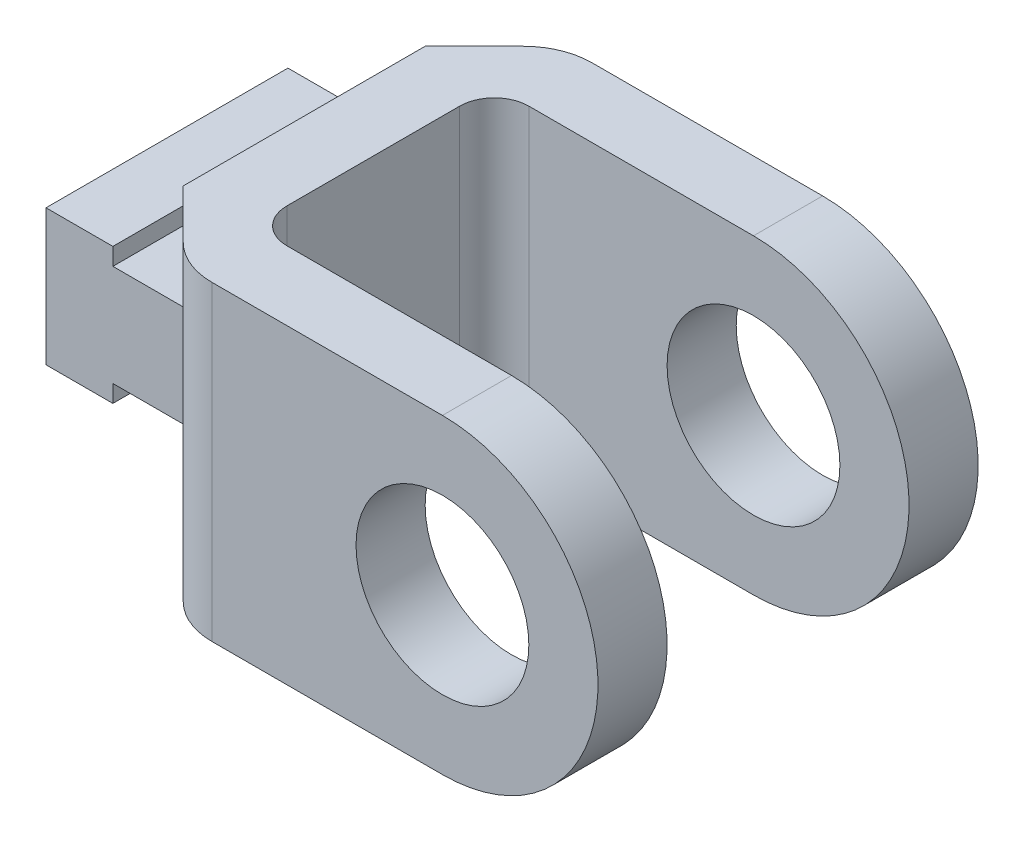
ISO-10303-21;
HEADER;
FILE_DESCRIPTION(('STEP AP214'),'2;1');
FILE_NAME('part.step','',(''),(''),'','','');
FILE_SCHEMA(('AUTOMOTIVE_DESIGN { 1 0 10303 214 1 1 1 1 }'));
ENDSEC;
DATA;
#1=APPLICATION_CONTEXT('core data for automotive mechanical design processes');
#2=APPLICATION_PROTOCOL_DEFINITION('international standard','automotive_design',2000,#1);
#3=PRODUCT_CONTEXT('',#1,'mechanical');
#4=PRODUCT('Part','Part','',(#3));
#5=PRODUCT_RELATED_PRODUCT_CATEGORY('part','',(#4));
#6=PRODUCT_DEFINITION_FORMATION('','',#4);
#7=PRODUCT_DEFINITION_CONTEXT('part definition',#1,'design');
#8=PRODUCT_DEFINITION('design','',#6,#7);
#9=PRODUCT_DEFINITION_SHAPE('','',#8);
#10=(LENGTH_UNIT() NAMED_UNIT(*) SI_UNIT(.MILLI.,.METRE.));
#11=(NAMED_UNIT(*) PLANE_ANGLE_UNIT() SI_UNIT($,.RADIAN.));
#12=(NAMED_UNIT(*) SI_UNIT($,.STERADIAN.) SOLID_ANGLE_UNIT());
#13=UNCERTAINTY_MEASURE_WITH_UNIT(LENGTH_MEASURE(1.E-05),#10,'distance_accuracy_value','');
#14=(GEOMETRIC_REPRESENTATION_CONTEXT(3) GLOBAL_UNCERTAINTY_ASSIGNED_CONTEXT((#13)) GLOBAL_UNIT_ASSIGNED_CONTEXT((#10,
#11,#12)) REPRESENTATION_CONTEXT('',''));
#15=CARTESIAN_POINT('',(0.,0.,0.));
#16=DIRECTION('',(0.,0.,1.));
#17=DIRECTION('',(1.,0.,0.));
#18=AXIS2_PLACEMENT_3D('',#15,#16,#17);
#19=CARTESIAN_POINT('',(-1.,4.5,7.));
#20=DIRECTION('',(0.,-1.,0.));
#21=DIRECTION('',(0.,0.,-1.));
#22=AXIS2_PLACEMENT_3D('',#19,#20,#21);
#23=PLANE('',#22);
#24=DIRECTION('',(0.707106781186548,0.,0.707106781186548));
#25=VECTOR('',#24,1.);
#26=CARTESIAN_POINT('',(-1.,4.5,7.));
#27=LINE('',#26,#25);
#28=CARTESIAN_POINT('',(-1.,4.5,7.));
#29=VERTEX_POINT('',#28);
#30=CARTESIAN_POINT('',(0.414213562373097,4.5,8.4142135623731));
#31=VERTEX_POINT('',#30);
#32=EDGE_CURVE('E203',#29,#31,#27,.T.);
#33=ORIENTED_EDGE('',*,*,#32,.T.);
#34=CARTESIAN_POINT('',(1.82842712474619,4.5,7.));
#35=DIRECTION('',(0.,-1.,0.));
#36=DIRECTION('',(0.,0.,-1.));
#37=AXIS2_PLACEMENT_3D('',#34,#35,#36);
#38=CIRCLE('',#37,2.);
#39=CARTESIAN_POINT('',(1.82842712474619,4.50000000000001,9.));
#40=VERTEX_POINT('',#39);
#41=EDGE_CURVE('E240',#31,#40,#38,.F.);
#42=ORIENTED_EDGE('',*,*,#41,.T.);
#43=DIRECTION('',(-1.,0.,0.));
#44=VECTOR('',#43,1.);
#45=CARTESIAN_POINT('',(-1.,4.5,9.));
#46=LINE('',#45,#44);
#47=CARTESIAN_POINT('',(8.49999999999999,4.50000000000001,9.));
#48=VERTEX_POINT('',#47);
#49=EDGE_CURVE('E274',#48,#40,#46,.T.);
#50=ORIENTED_EDGE('',*,*,#49,.F.);
#51=DIRECTION('',(0.,0.,-1.));
#52=VECTOR('',#51,1.);
#53=CARTESIAN_POINT('',(8.49999999999999,4.50000000000001,9.));
#54=LINE('',#53,#52);
#55=CARTESIAN_POINT('',(8.49999999999999,4.50000000000001,7.));
#56=VERTEX_POINT('',#55);
#57=EDGE_CURVE('E263',#48,#56,#54,.T.);
#58=ORIENTED_EDGE('',*,*,#57,.T.);
#59=DIRECTION('',(-1.,0.,0.));
#60=VECTOR('',#59,1.);
#61=CARTESIAN_POINT('',(-1.,4.5,7.));
#62=LINE('',#61,#60);
#63=CARTESIAN_POINT('',(2.,4.50000000000001,7.));
#64=VERTEX_POINT('',#63);
#65=EDGE_CURVE('E255',#56,#64,#62,.T.);
#66=ORIENTED_EDGE('',*,*,#65,.T.);
#67=CARTESIAN_POINT('',(2.,4.5,6.));
#68=DIRECTION('',(0.,-1.,0.));
#69=DIRECTION('',(0.,0.,-1.));
#70=AXIS2_PLACEMENT_3D('',#67,#68,#69);
#71=CIRCLE('',#70,1.);
#72=CARTESIAN_POINT('',(1.,4.5,6.));
#73=VERTEX_POINT('',#72);
#74=EDGE_CURVE('E41',#64,#73,#71,.T.);
#75=ORIENTED_EDGE('',*,*,#74,.T.);
#76=DIRECTION('',(0.,0.,-1.));
#77=VECTOR('',#76,1.);
#78=CARTESIAN_POINT('',(1.,4.5,7.));
#79=LINE('',#78,#77);
#80=CARTESIAN_POINT('',(1.,4.5,1.));
#81=VERTEX_POINT('',#80);
#82=EDGE_CURVE('E211',#73,#81,#79,.T.);
#83=ORIENTED_EDGE('',*,*,#82,.T.);
#84=CARTESIAN_POINT('',(2.,4.5,1.));
#85=DIRECTION('',(0.,-1.,0.));
#86=DIRECTION('',(0.,0.,-1.));
#87=AXIS2_PLACEMENT_3D('',#84,#85,#86);
#88=CIRCLE('',#87,1.);
#89=CARTESIAN_POINT('',(2.,4.50000000000001,0.));
#90=VERTEX_POINT('',#89);
#91=EDGE_CURVE('E224',#81,#90,#88,.T.);
#92=ORIENTED_EDGE('',*,*,#91,.T.);
#93=DIRECTION('',(-1.,0.,0.));
#94=VECTOR('',#93,1.);
#95=CARTESIAN_POINT('',(-1.,4.5,0.));
#96=LINE('',#95,#94);
#97=CARTESIAN_POINT('',(8.49999999999999,4.50000000000001,0.));
#98=VERTEX_POINT('',#97);
#99=EDGE_CURVE('E297',#98,#90,#96,.T.);
#100=ORIENTED_EDGE('',*,*,#99,.F.);
#101=DIRECTION('',(0.,0.,1.));
#102=VECTOR('',#101,1.);
#103=CARTESIAN_POINT('',(8.49999999999999,4.50000000000001,-2.));
#104=LINE('',#103,#102);
#105=CARTESIAN_POINT('',(8.49999999999999,4.50000000000001,-2.));
#106=VERTEX_POINT('',#105);
#107=EDGE_CURVE('E312',#106,#98,#104,.T.);
#108=ORIENTED_EDGE('',*,*,#107,.F.);
#109=DIRECTION('',(-1.,0.,0.));
#110=VECTOR('',#109,1.);
#111=CARTESIAN_POINT('',(-1.,4.5,-2.));
#112=LINE('',#111,#110);
#113=CARTESIAN_POINT('',(1.82842712474619,4.50000000000001,-2.));
#114=VERTEX_POINT('',#113);
#115=EDGE_CURVE('E300',#106,#114,#112,.T.);
#116=ORIENTED_EDGE('',*,*,#115,.T.);
#117=CARTESIAN_POINT('',(1.82842712474619,4.5,0.));
#118=DIRECTION('',(0.,-1.,0.));
#119=DIRECTION('',(0.,0.,-1.));
#120=AXIS2_PLACEMENT_3D('',#117,#118,#119);
#121=CIRCLE('',#120,2.);
#122=CARTESIAN_POINT('',(0.414213562373095,4.5,-1.41421356237309));
#123=VERTEX_POINT('',#122);
#124=EDGE_CURVE('E232',#114,#123,#121,.F.);
#125=ORIENTED_EDGE('',*,*,#124,.T.);
#126=DIRECTION('',(0.707106781186548,0.,-0.707106781186548));
#127=VECTOR('',#126,1.);
#128=CARTESIAN_POINT('',(-1.,4.5,0.));
#129=LINE('',#128,#127);
#130=CARTESIAN_POINT('',(-1.,4.5,0.));
#131=VERTEX_POINT('',#130);
#132=EDGE_CURVE('E278',#131,#123,#129,.T.);
#133=ORIENTED_EDGE('',*,*,#132,.F.);
#134=DIRECTION('',(0.,0.,-1.));
#135=VECTOR('',#134,1.);
#136=CARTESIAN_POINT('',(-1.,4.5,7.));
#137=LINE('',#136,#135);
#138=EDGE_CURVE('E208',#29,#131,#137,.T.);
#139=ORIENTED_EDGE('',*,*,#138,.F.);
#140=EDGE_LOOP('',(#33,#42,#50,#58,#66,#75,#83,#92,#100,#108,#116,#125,#133,#139));
#141=FACE_BOUND('',#140,.T.);
#142=ADVANCED_FACE('F33',(#141),#23,.F.);
#143=CARTESIAN_POINT('',(-1.,4.5,7.));
#144=DIRECTION('',(1.,0.,0.));
#145=DIRECTION('',(0.,0.,-1.));
#146=AXIS2_PLACEMENT_3D('',#143,#144,#145);
#147=PLANE('',#146);
#148=DIRECTION('',(0.,1.,0.));
#149=VECTOR('',#148,1.);
#150=CARTESIAN_POINT('',(-1.,-4.5,7.));
#151=LINE('',#150,#149);
#152=CARTESIAN_POINT('',(-1.,1.4675,7.));
#153=VERTEX_POINT('',#152);
#154=EDGE_CURVE('E193',#153,#29,#151,.T.);
#155=ORIENTED_EDGE('',*,*,#154,.T.);
#156=ORIENTED_EDGE('',*,*,#138,.T.);
#157=DIRECTION('',(0.,1.,0.));
#158=VECTOR('',#157,1.);
#159=CARTESIAN_POINT('',(-1.,-4.5,0.));
#160=LINE('',#159,#158);
#161=CARTESIAN_POINT('',(-1.,1.4675,0.));
#162=VERTEX_POINT('',#161);
#163=EDGE_CURVE('E283',#162,#131,#160,.T.);
#164=ORIENTED_EDGE('',*,*,#163,.F.);
#165=DIRECTION('',(0.,0.,-1.));
#166=VECTOR('',#165,1.);
#167=CARTESIAN_POINT('',(-1.,1.4675,7.));
#168=LINE('',#167,#166);
#169=EDGE_CURVE('E213',#153,#162,#168,.T.);
#170=ORIENTED_EDGE('',*,*,#169,.F.);
#171=EDGE_LOOP('',(#155,#156,#164,#170));
#172=FACE_BOUND('',#171,.T.);
#173=ADVANCED_FACE('F416',(#172),#147,.F.);
#174=CARTESIAN_POINT('',(-1.,-4.5,7.));
#175=VERTEX_POINT('',#174);
#176=CARTESIAN_POINT('',(-1.,-1.4675,7.));
#177=VERTEX_POINT('',#176);
#178=EDGE_CURVE('E180',#175,#177,#151,.T.);
#179=ORIENTED_EDGE('',*,*,#178,.T.);
#180=DIRECTION('',(0.,0.,-1.));
#181=VECTOR('',#180,1.);
#182=CARTESIAN_POINT('',(-1.,-1.4675,7.));
#183=LINE('',#182,#181);
#184=CARTESIAN_POINT('',(-1.,-1.4675,0.));
#185=VERTEX_POINT('',#184);
#186=EDGE_CURVE('E351',#177,#185,#183,.T.);
#187=ORIENTED_EDGE('',*,*,#186,.T.);
#188=CARTESIAN_POINT('',(-1.,-4.5,0.));
#189=VERTEX_POINT('',#188);
#190=EDGE_CURVE('E207',#189,#185,#160,.T.);
#191=ORIENTED_EDGE('',*,*,#190,.F.);
#192=DIRECTION('',(0.,0.,-1.));
#193=VECTOR('',#192,1.);
#194=CARTESIAN_POINT('',(-1.,-4.5,7.));
#195=LINE('',#194,#193);
#196=EDGE_CURVE('E199',#175,#189,#195,.T.);
#197=ORIENTED_EDGE('',*,*,#196,.F.);
#198=EDGE_LOOP('',(#179,#187,#191,#197));
#199=FACE_BOUND('',#198,.T.);
#200=ADVANCED_FACE('F206',(#199),#147,.F.);
#201=CARTESIAN_POINT('',(-1.,-4.5,7.));
#202=DIRECTION('',(0.,1.,0.));
#203=DIRECTION('',(0.,0.,1.));
#204=AXIS2_PLACEMENT_3D('',#201,#202,#203);
#205=PLANE('',#204);
#206=DIRECTION('',(1.,0.,0.));
#207=VECTOR('',#206,1.);
#208=CARTESIAN_POINT('',(-0.999999999999999,-4.5,9.));
#209=LINE('',#208,#207);
#210=CARTESIAN_POINT('',(1.82842712474619,-4.5,9.));
#211=VERTEX_POINT('',#210);
#212=CARTESIAN_POINT('',(8.5,-4.5,9.));
#213=VERTEX_POINT('',#212);
#214=EDGE_CURVE('E280',#211,#213,#209,.T.);
#215=ORIENTED_EDGE('',*,*,#214,.F.);
#216=CARTESIAN_POINT('',(1.82842712474619,-4.5,7.));
#217=DIRECTION('',(0.,1.,0.));
#218=DIRECTION('',(0.,0.,1.));
#219=AXIS2_PLACEMENT_3D('',#216,#217,#218);
#220=CIRCLE('',#219,2.);
#221=CARTESIAN_POINT('',(0.414213562373097,-4.5,8.4142135623731));
#222=VERTEX_POINT('',#221);
#223=EDGE_CURVE('E202',#211,#222,#220,.F.);
#224=ORIENTED_EDGE('',*,*,#223,.T.);
#225=DIRECTION('',(0.707106781186548,0.,0.707106781186548));
#226=VECTOR('',#225,1.);
#227=CARTESIAN_POINT('',(-1.,-4.5,7.));
#228=LINE('',#227,#226);
#229=EDGE_CURVE('E184',#175,#222,#228,.T.);
#230=ORIENTED_EDGE('',*,*,#229,.F.);
#231=ORIENTED_EDGE('',*,*,#196,.T.);
#232=DIRECTION('',(0.707106781186548,0.,-0.707106781186548));
#233=VECTOR('',#232,1.);
#234=CARTESIAN_POINT('',(-1.,-4.5,0.));
#235=LINE('',#234,#233);
#236=CARTESIAN_POINT('',(0.414213562373095,-4.5,-1.41421356237309));
#237=VERTEX_POINT('',#236);
#238=EDGE_CURVE('E281',#189,#237,#235,.T.);
#239=ORIENTED_EDGE('',*,*,#238,.T.);
#240=CARTESIAN_POINT('',(1.82842712474619,-4.5,0.));
#241=DIRECTION('',(0.,1.,0.));
#242=DIRECTION('',(0.,0.,1.));
#243=AXIS2_PLACEMENT_3D('',#240,#241,#242);
#244=CIRCLE('',#243,2.);
#245=CARTESIAN_POINT('',(1.82842712474619,-4.5,-2.));
#246=VERTEX_POINT('',#245);
#247=EDGE_CURVE('E236',#237,#246,#244,.F.);
#248=ORIENTED_EDGE('',*,*,#247,.T.);
#249=DIRECTION('',(1.,0.,0.));
#250=VECTOR('',#249,1.);
#251=CARTESIAN_POINT('',(-0.999999999999999,-4.5,-2.));
#252=LINE('',#251,#250);
#253=CARTESIAN_POINT('',(8.5,-4.5,-2.));
#254=VERTEX_POINT('',#253);
#255=EDGE_CURVE('E294',#246,#254,#252,.T.);
#256=ORIENTED_EDGE('',*,*,#255,.T.);
#257=DIRECTION('',(0.,0.,1.));
#258=VECTOR('',#257,1.);
#259=CARTESIAN_POINT('',(8.5,-4.5,-2.));
#260=LINE('',#259,#258);
#261=CARTESIAN_POINT('',(8.5,-4.5,0.));
#262=VERTEX_POINT('',#261);
#263=EDGE_CURVE('E303',#254,#262,#260,.T.);
#264=ORIENTED_EDGE('',*,*,#263,.T.);
#265=DIRECTION('',(1.,0.,0.));
#266=VECTOR('',#265,1.);
#267=CARTESIAN_POINT('',(-0.999999999999999,-4.5,0.));
#268=LINE('',#267,#266);
#269=CARTESIAN_POINT('',(2.,-4.5,0.));
#270=VERTEX_POINT('',#269);
#271=EDGE_CURVE('E291',#270,#262,#268,.T.);
#272=ORIENTED_EDGE('',*,*,#271,.F.);
#273=CARTESIAN_POINT('',(2.,-4.5,1.));
#274=DIRECTION('',(0.,1.,0.));
#275=DIRECTION('',(0.,0.,1.));
#276=AXIS2_PLACEMENT_3D('',#273,#274,#275);
#277=CIRCLE('',#276,1.);
#278=CARTESIAN_POINT('',(1.,-4.5,1.));
#279=VERTEX_POINT('',#278);
#280=EDGE_CURVE('E226',#270,#279,#277,.T.);
#281=ORIENTED_EDGE('',*,*,#280,.T.);
#282=DIRECTION('',(0.,0.,-1.));
#283=VECTOR('',#282,1.);
#284=CARTESIAN_POINT('',(1.,-4.5,7.));
#285=LINE('',#284,#283);
#286=CARTESIAN_POINT('',(1.,-4.5,6.));
#287=VERTEX_POINT('',#286);
#288=EDGE_CURVE('E209',#287,#279,#285,.T.);
#289=ORIENTED_EDGE('',*,*,#288,.F.);
#290=CARTESIAN_POINT('',(2.,-4.5,6.));
#291=DIRECTION('',(0.,1.,0.));
#292=DIRECTION('',(0.,0.,1.));
#293=AXIS2_PLACEMENT_3D('',#290,#291,#292);
#294=CIRCLE('',#293,1.);
#295=CARTESIAN_POINT('',(2.,-4.5,7.));
#296=VERTEX_POINT('',#295);
#297=EDGE_CURVE('E11',#287,#296,#294,.T.);
#298=ORIENTED_EDGE('',*,*,#297,.T.);
#299=DIRECTION('',(1.,0.,0.));
#300=VECTOR('',#299,1.);
#301=CARTESIAN_POINT('',(-0.999999999999999,-4.5,7.));
#302=LINE('',#301,#300);
#303=CARTESIAN_POINT('',(8.5,-4.5,7.));
#304=VERTEX_POINT('',#303);
#305=EDGE_CURVE('E256',#296,#304,#302,.T.);
#306=ORIENTED_EDGE('',*,*,#305,.T.);
#307=DIRECTION('',(0.,0.,-1.));
#308=VECTOR('',#307,1.);
#309=CARTESIAN_POINT('',(8.5,-4.5,9.));
#310=LINE('',#309,#308);
#311=EDGE_CURVE('E275',#213,#304,#310,.T.);
#312=ORIENTED_EDGE('',*,*,#311,.F.);
#313=EDGE_LOOP('',(#215,#224,#230,#231,#239,#248,#256,#264,#272,#281,#289,#298,#306,#312));
#314=FACE_BOUND('',#313,.T.);
#315=ADVANCED_FACE('F197',(#314),#205,.F.);
#316=CARTESIAN_POINT('',(8.5,0.,9.));
#317=DIRECTION('',(0.,0.,-1.));
#318=DIRECTION('',(1.,0.,0.));
#319=AXIS2_PLACEMENT_3D('',#316,#317,#318);
#320=PLANE('',#319);
#321=CARTESIAN_POINT('',(8.5,0.,9.));
#322=DIRECTION('',(0.,0.,1.));
#323=DIRECTION('',(1.,0.,0.));
#324=AXIS2_PLACEMENT_3D('',#321,#322,#323);
#325=CIRCLE('',#324,2.5);
#326=CARTESIAN_POINT('',(11.,0.,9.));
#327=VERTEX_POINT('',#326);
#328=EDGE_CURVE('E265',#327,#327,#325,.T.);
#329=ORIENTED_EDGE('',*,*,#328,.F.);
#330=EDGE_LOOP('',(#329));
#331=FACE_BOUND('',#330,.T.);
#332=ORIENTED_EDGE('',*,*,#49,.T.);
#333=DIRECTION('',(0.,1.,0.));
#334=VECTOR('',#333,1.);
#335=CARTESIAN_POINT('',(1.82842712474619,-4.5,9.));
#336=LINE('',#335,#334);
#337=EDGE_CURVE('E242',#40,#211,#336,.F.);
#338=ORIENTED_EDGE('',*,*,#337,.T.);
#339=ORIENTED_EDGE('',*,*,#214,.T.);
#340=CARTESIAN_POINT('',(8.5,0.,9.));
#341=DIRECTION('',(0.,0.,1.));
#342=DIRECTION('',(1.,0.,0.));
#343=AXIS2_PLACEMENT_3D('',#340,#341,#342);
#344=CIRCLE('',#343,4.5);
#345=EDGE_CURVE('E453',#213,#48,#344,.T.);
#346=ORIENTED_EDGE('',*,*,#345,.T.);
#347=EDGE_LOOP('',(#332,#338,#339,#346));
#348=FACE_BOUND('',#347,.T.);
#349=ADVANCED_FACE('F456',(#331,#348),#320,.F.);
#350=CARTESIAN_POINT('',(0.,0.,7.));
#351=DIRECTION('',(0.,0.,-1.));
#352=DIRECTION('',(-1.,0.,0.));
#353=AXIS2_PLACEMENT_3D('',#350,#351,#352);
#354=PLANE('',#353);
#355=DIRECTION('',(0.,-1.,0.));
#356=VECTOR('',#355,1.);
#357=CARTESIAN_POINT('',(-1.,4.5,7.));
#358=LINE('',#357,#356);
#359=EDGE_CURVE('E187',#153,#177,#358,.T.);
#360=ORIENTED_EDGE('',*,*,#359,.F.);
#361=DIRECTION('',(-1.,0.,0.));
#362=VECTOR('',#361,1.);
#363=CARTESIAN_POINT('',(-3.035,1.4675,7.));
#364=LINE('',#363,#362);
#365=CARTESIAN_POINT('',(-3.035,1.4675,7.));
#366=VERTEX_POINT('',#365);
#367=EDGE_CURVE('E337',#153,#366,#364,.T.);
#368=ORIENTED_EDGE('',*,*,#367,.T.);
#369=DIRECTION('',(0.,1.,0.));
#370=VECTOR('',#369,1.);
#371=CARTESIAN_POINT('',(-3.035,1.4675,7.));
#372=LINE('',#371,#370);
#373=CARTESIAN_POINT('',(-3.035,1.9675,7.));
#374=VERTEX_POINT('',#373);
#375=EDGE_CURVE('E339',#366,#374,#372,.T.);
#376=ORIENTED_EDGE('',*,*,#375,.T.);
#377=DIRECTION('',(-1.,0.,0.));
#378=VECTOR('',#377,1.);
#379=CARTESIAN_POINT('',(-4.97,1.9675,7.));
#380=LINE('',#379,#378);
#381=CARTESIAN_POINT('',(-4.97,1.9675,7.));
#382=VERTEX_POINT('',#381);
#383=EDGE_CURVE('E341',#374,#382,#380,.T.);
#384=ORIENTED_EDGE('',*,*,#383,.T.);
#385=DIRECTION('',(0.,-1.,0.));
#386=VECTOR('',#385,1.);
#387=CARTESIAN_POINT('',(-4.97,-1.9675,7.));
#388=LINE('',#387,#386);
#389=CARTESIAN_POINT('',(-4.97,-1.9675,7.));
#390=VERTEX_POINT('',#389);
#391=EDGE_CURVE('E343',#382,#390,#388,.T.);
#392=ORIENTED_EDGE('',*,*,#391,.T.);
#393=DIRECTION('',(1.,0.,0.));
#394=VECTOR('',#393,1.);
#395=CARTESIAN_POINT('',(-4.97,-1.9675,7.));
#396=LINE('',#395,#394);
#397=CARTESIAN_POINT('',(-3.035,-1.9675,7.));
#398=VERTEX_POINT('',#397);
#399=EDGE_CURVE('E345',#390,#398,#396,.T.);
#400=ORIENTED_EDGE('',*,*,#399,.T.);
#401=DIRECTION('',(0.,1.,0.));
#402=VECTOR('',#401,1.);
#403=CARTESIAN_POINT('',(-3.035,-1.9675,7.));
#404=LINE('',#403,#402);
#405=CARTESIAN_POINT('',(-3.035,-1.4675,7.));
#406=VERTEX_POINT('',#405);
#407=EDGE_CURVE('E347',#398,#406,#404,.T.);
#408=ORIENTED_EDGE('',*,*,#407,.T.);
#409=DIRECTION('',(1.,0.,0.));
#410=VECTOR('',#409,1.);
#411=CARTESIAN_POINT('',(-3.035,-1.4675,7.));
#412=LINE('',#411,#410);
#413=EDGE_CURVE('E349',#406,#177,#412,.T.);
#414=ORIENTED_EDGE('',*,*,#413,.T.);
#415=EDGE_LOOP('',(#360,#368,#376,#384,#392,#400,#408,#414));
#416=FACE_BOUND('',#415,.T.);
#417=ADVANCED_FACE('F386',(#416),#354,.F.);
#418=CARTESIAN_POINT('',(0.,0.,0.));
#419=DIRECTION('',(0.,0.,-1.));
#420=DIRECTION('',(-1.,0.,0.));
#421=AXIS2_PLACEMENT_3D('',#418,#419,#420);
#422=PLANE('',#421);
#423=DIRECTION('',(-1.,0.,0.));
#424=VECTOR('',#423,1.);
#425=CARTESIAN_POINT('',(-3.035,1.4675,0.));
#426=LINE('',#425,#424);
#427=CARTESIAN_POINT('',(-3.035,1.4675,0.));
#428=VERTEX_POINT('',#427);
#429=EDGE_CURVE('E314',#162,#428,#426,.T.);
#430=ORIENTED_EDGE('',*,*,#429,.F.);
#431=DIRECTION('',(0.,-1.,0.));
#432=VECTOR('',#431,1.);
#433=CARTESIAN_POINT('',(-1.,4.5,0.));
#434=LINE('',#433,#432);
#435=EDGE_CURVE('E218',#162,#185,#434,.T.);
#436=ORIENTED_EDGE('',*,*,#435,.T.);
#437=DIRECTION('',(1.,0.,0.));
#438=VECTOR('',#437,1.);
#439=CARTESIAN_POINT('',(-3.035,-1.4675,0.));
#440=LINE('',#439,#438);
#441=CARTESIAN_POINT('',(-3.035,-1.4675,0.));
#442=VERTEX_POINT('',#441);
#443=EDGE_CURVE('E334',#442,#185,#440,.T.);
#444=ORIENTED_EDGE('',*,*,#443,.F.);
#445=DIRECTION('',(0.,1.,0.));
#446=VECTOR('',#445,1.);
#447=CARTESIAN_POINT('',(-3.035,-1.9675,0.));
#448=LINE('',#447,#446);
#449=CARTESIAN_POINT('',(-3.035,-1.9675,0.));
#450=VERTEX_POINT('',#449);
#451=EDGE_CURVE('E331',#450,#442,#448,.T.);
#452=ORIENTED_EDGE('',*,*,#451,.F.);
#453=DIRECTION('',(1.,0.,0.));
#454=VECTOR('',#453,1.);
#455=CARTESIAN_POINT('',(-4.97,-1.9675,0.));
#456=LINE('',#455,#454);
#457=CARTESIAN_POINT('',(-4.97,-1.9675,0.));
#458=VERTEX_POINT('',#457);
#459=EDGE_CURVE('E328',#458,#450,#456,.T.);
#460=ORIENTED_EDGE('',*,*,#459,.F.);
#461=DIRECTION('',(0.,-1.,0.));
#462=VECTOR('',#461,1.);
#463=CARTESIAN_POINT('',(-4.97,-1.9675,0.));
#464=LINE('',#463,#462);
#465=CARTESIAN_POINT('',(-4.97,1.9675,0.));
#466=VERTEX_POINT('',#465);
#467=EDGE_CURVE('E325',#466,#458,#464,.T.);
#468=ORIENTED_EDGE('',*,*,#467,.F.);
#469=DIRECTION('',(-1.,0.,0.));
#470=VECTOR('',#469,1.);
#471=CARTESIAN_POINT('',(-4.97,1.9675,0.));
#472=LINE('',#471,#470);
#473=CARTESIAN_POINT('',(-3.035,1.9675,0.));
#474=VERTEX_POINT('',#473);
#475=EDGE_CURVE('E322',#474,#466,#472,.T.);
#476=ORIENTED_EDGE('',*,*,#475,.F.);
#477=DIRECTION('',(0.,1.,0.));
#478=VECTOR('',#477,1.);
#479=CARTESIAN_POINT('',(-3.035,1.4675,0.));
#480=LINE('',#479,#478);
#481=EDGE_CURVE('E319',#428,#474,#480,.T.);
#482=ORIENTED_EDGE('',*,*,#481,.F.);
#483=EDGE_LOOP('',(#430,#436,#444,#452,#460,#468,#476,#482));
#484=FACE_BOUND('',#483,.T.);
#485=ADVANCED_FACE('F376',(#484),#422,.T.);
#486=CARTESIAN_POINT('',(1.,-4.5,7.));
#487=DIRECTION('',(-1.,0.,0.));
#488=DIRECTION('',(0.,0.,1.));
#489=AXIS2_PLACEMENT_3D('',#486,#487,#488);
#490=PLANE('',#489);
#491=ORIENTED_EDGE('',*,*,#82,.F.);
#492=DIRECTION('',(0.,1.,0.));
#493=VECTOR('',#492,1.);
#494=CARTESIAN_POINT('',(1.,-4.5,6.));
#495=LINE('',#494,#493);
#496=EDGE_CURVE('E54',#73,#287,#495,.F.);
#497=ORIENTED_EDGE('',*,*,#496,.T.);
#498=ORIENTED_EDGE('',*,*,#288,.T.);
#499=DIRECTION('',(0.,1.,0.));
#500=VECTOR('',#499,1.);
#501=CARTESIAN_POINT('',(1.,-4.5,1.));
#502=LINE('',#501,#500);
#503=EDGE_CURVE('E219',#279,#81,#502,.T.);
#504=ORIENTED_EDGE('',*,*,#503,.T.);
#505=EDGE_LOOP('',(#491,#497,#498,#504));
#506=FACE_BOUND('',#505,.T.);
#507=ADVANCED_FACE('F424',(#506),#490,.F.);
#508=CARTESIAN_POINT('',(-3.035,1.4675,7.));
#509=DIRECTION('',(0.,-1.,0.));
#510=DIRECTION('',(0.,0.,-1.));
#511=AXIS2_PLACEMENT_3D('',#508,#509,#510);
#512=PLANE('',#511);
#513=ORIENTED_EDGE('',*,*,#169,.T.);
#514=ORIENTED_EDGE('',*,*,#429,.T.);
#515=DIRECTION('',(0.,0.,-1.));
#516=VECTOR('',#515,1.);
#517=CARTESIAN_POINT('',(-3.035,1.4675,7.));
#518=LINE('',#517,#516);
#519=EDGE_CURVE('E363',#366,#428,#518,.T.);
#520=ORIENTED_EDGE('',*,*,#519,.F.);
#521=ORIENTED_EDGE('',*,*,#367,.F.);
#522=EDGE_LOOP('',(#513,#514,#520,#521));
#523=FACE_BOUND('',#522,.T.);
#524=ADVANCED_FACE('F369',(#523),#512,.F.);
#525=CARTESIAN_POINT('',(-3.035,1.4675,7.));
#526=DIRECTION('',(-1.,0.,0.));
#527=DIRECTION('',(0.,0.,1.));
#528=AXIS2_PLACEMENT_3D('',#525,#526,#527);
#529=PLANE('',#528);
#530=ORIENTED_EDGE('',*,*,#519,.T.);
#531=ORIENTED_EDGE('',*,*,#481,.T.);
#532=DIRECTION('',(0.,0.,-1.));
#533=VECTOR('',#532,1.);
#534=CARTESIAN_POINT('',(-3.035,1.9675,7.));
#535=LINE('',#534,#533);
#536=EDGE_CURVE('E361',#374,#474,#535,.T.);
#537=ORIENTED_EDGE('',*,*,#536,.F.);
#538=ORIENTED_EDGE('',*,*,#375,.F.);
#539=EDGE_LOOP('',(#530,#531,#537,#538));
#540=FACE_BOUND('',#539,.T.);
#541=ADVANCED_FACE('F382',(#540),#529,.F.);
#542=CARTESIAN_POINT('',(-4.97,1.9675,7.));
#543=DIRECTION('',(0.,-1.,0.));
#544=DIRECTION('',(0.,0.,-1.));
#545=AXIS2_PLACEMENT_3D('',#542,#543,#544);
#546=PLANE('',#545);
#547=ORIENTED_EDGE('',*,*,#536,.T.);
#548=ORIENTED_EDGE('',*,*,#475,.T.);
#549=DIRECTION('',(0.,0.,-1.));
#550=VECTOR('',#549,1.);
#551=CARTESIAN_POINT('',(-4.97,1.9675,7.));
#552=LINE('',#551,#550);
#553=EDGE_CURVE('E359',#382,#466,#552,.T.);
#554=ORIENTED_EDGE('',*,*,#553,.F.);
#555=ORIENTED_EDGE('',*,*,#383,.F.);
#556=EDGE_LOOP('',(#547,#548,#554,#555));
#557=FACE_BOUND('',#556,.T.);
#558=ADVANCED_FACE('F406',(#557),#546,.F.);
#559=CARTESIAN_POINT('',(-4.97,-1.9675,7.));
#560=DIRECTION('',(1.,0.,0.));
#561=DIRECTION('',(0.,0.,-1.));
#562=AXIS2_PLACEMENT_3D('',#559,#560,#561);
#563=PLANE('',#562);
#564=ORIENTED_EDGE('',*,*,#553,.T.);
#565=ORIENTED_EDGE('',*,*,#467,.T.);
#566=DIRECTION('',(0.,0.,-1.));
#567=VECTOR('',#566,1.);
#568=CARTESIAN_POINT('',(-4.97,-1.9675,7.));
#569=LINE('',#568,#567);
#570=EDGE_CURVE('E357',#390,#458,#569,.T.);
#571=ORIENTED_EDGE('',*,*,#570,.F.);
#572=ORIENTED_EDGE('',*,*,#391,.F.);
#573=EDGE_LOOP('',(#564,#565,#571,#572));
#574=FACE_BOUND('',#573,.T.);
#575=ADVANCED_FACE('F404',(#574),#563,.F.);
#576=CARTESIAN_POINT('',(-4.97,-1.9675,7.));
#577=DIRECTION('',(0.,1.,0.));
#578=DIRECTION('',(0.,0.,1.));
#579=AXIS2_PLACEMENT_3D('',#576,#577,#578);
#580=PLANE('',#579);
#581=ORIENTED_EDGE('',*,*,#570,.T.);
#582=ORIENTED_EDGE('',*,*,#459,.T.);
#583=DIRECTION('',(0.,0.,-1.));
#584=VECTOR('',#583,1.);
#585=CARTESIAN_POINT('',(-3.035,-1.9675,7.));
#586=LINE('',#585,#584);
#587=EDGE_CURVE('E355',#398,#450,#586,.T.);
#588=ORIENTED_EDGE('',*,*,#587,.F.);
#589=ORIENTED_EDGE('',*,*,#399,.F.);
#590=EDGE_LOOP('',(#581,#582,#588,#589));
#591=FACE_BOUND('',#590,.T.);
#592=ADVANCED_FACE('F399',(#591),#580,.F.);
#593=CARTESIAN_POINT('',(-3.035,-1.9675,7.));
#594=DIRECTION('',(-1.,0.,0.));
#595=DIRECTION('',(0.,0.,1.));
#596=AXIS2_PLACEMENT_3D('',#593,#594,#595);
#597=PLANE('',#596);
#598=ORIENTED_EDGE('',*,*,#587,.T.);
#599=ORIENTED_EDGE('',*,*,#451,.T.);
#600=DIRECTION('',(0.,0.,-1.));
#601=VECTOR('',#600,1.);
#602=CARTESIAN_POINT('',(-3.035,-1.4675,7.));
#603=LINE('',#602,#601);
#604=EDGE_CURVE('E353',#406,#442,#603,.T.);
#605=ORIENTED_EDGE('',*,*,#604,.F.);
#606=ORIENTED_EDGE('',*,*,#407,.F.);
#607=EDGE_LOOP('',(#598,#599,#605,#606));
#608=FACE_BOUND('',#607,.T.);
#609=ADVANCED_FACE('F492',(#608),#597,.F.);
#610=CARTESIAN_POINT('',(-3.035,-1.4675,7.));
#611=DIRECTION('',(0.,1.,0.));
#612=DIRECTION('',(-1.,0.,0.));
#613=AXIS2_PLACEMENT_3D('',#610,#611,#612);
#614=PLANE('',#613);
#615=ORIENTED_EDGE('',*,*,#604,.T.);
#616=ORIENTED_EDGE('',*,*,#443,.T.);
#617=ORIENTED_EDGE('',*,*,#186,.F.);
#618=ORIENTED_EDGE('',*,*,#413,.F.);
#619=EDGE_LOOP('',(#615,#616,#617,#618));
#620=FACE_BOUND('',#619,.T.);
#621=ADVANCED_FACE('F393',(#620),#614,.F.);
#622=CARTESIAN_POINT('',(8.5,0.,0.));
#623=DIRECTION('',(0.,0.,1.));
#624=DIRECTION('',(1.,0.,0.));
#625=AXIS2_PLACEMENT_3D('',#622,#623,#624);
#626=PLANE('',#625);
#627=CARTESIAN_POINT('',(8.5,0.,0.));
#628=DIRECTION('',(0.,0.,1.));
#629=DIRECTION('',(1.,0.,0.));
#630=AXIS2_PLACEMENT_3D('',#627,#628,#629);
#631=CIRCLE('',#630,2.5);
#632=CARTESIAN_POINT('',(11.,0.,0.));
#633=VERTEX_POINT('',#632);
#634=EDGE_CURVE('E287',#633,#633,#631,.T.);
#635=ORIENTED_EDGE('',*,*,#634,.F.);
#636=EDGE_LOOP('',(#635));
#637=FACE_BOUND('',#636,.T.);
#638=ORIENTED_EDGE('',*,*,#99,.T.);
#639=DIRECTION('',(0.,1.,0.));
#640=VECTOR('',#639,1.);
#641=CARTESIAN_POINT('',(2.,0.,0.));
#642=LINE('',#641,#640);
#643=EDGE_CURVE('E222',#90,#270,#642,.F.);
#644=ORIENTED_EDGE('',*,*,#643,.T.);
#645=ORIENTED_EDGE('',*,*,#271,.T.);
#646=CARTESIAN_POINT('',(8.5,0.,0.));
#647=DIRECTION('',(0.,0.,1.));
#648=DIRECTION('',(1.,0.,0.));
#649=AXIS2_PLACEMENT_3D('',#646,#647,#648);
#650=CIRCLE('',#649,4.5);
#651=EDGE_CURVE('E307',#262,#98,#650,.T.);
#652=ORIENTED_EDGE('',*,*,#651,.T.);
#653=EDGE_LOOP('',(#638,#644,#645,#652));
#654=FACE_BOUND('',#653,.T.);
#655=ADVANCED_FACE('F483',(#637,#654),#626,.T.);
#656=CARTESIAN_POINT('',(8.5,0.,-2.));
#657=DIRECTION('',(0.,0.,1.));
#658=DIRECTION('',(1.,0.,0.));
#659=AXIS2_PLACEMENT_3D('',#656,#657,#658);
#660=CYLINDRICAL_SURFACE('',#659,4.5);
#661=ORIENTED_EDGE('',*,*,#651,.F.);
#662=ORIENTED_EDGE('',*,*,#263,.F.);
#663=CARTESIAN_POINT('',(8.5,0.,-2.));
#664=DIRECTION('',(0.,0.,1.));
#665=DIRECTION('',(1.,0.,0.));
#666=AXIS2_PLACEMENT_3D('',#663,#664,#665);
#667=CIRCLE('',#666,4.5);
#668=EDGE_CURVE('E296',#254,#106,#667,.T.);
#669=ORIENTED_EDGE('',*,*,#668,.T.);
#670=ORIENTED_EDGE('',*,*,#107,.T.);
#671=EDGE_LOOP('',(#661,#662,#669,#670));
#672=FACE_BOUND('',#671,.T.);
#673=ADVANCED_FACE('F481',(#672),#660,.T.);
#674=CARTESIAN_POINT('',(8.5,0.,-2.));
#675=DIRECTION('',(0.,0.,1.));
#676=DIRECTION('',(1.,0.,0.));
#677=AXIS2_PLACEMENT_3D('',#674,#675,#676);
#678=PLANE('',#677);
#679=CARTESIAN_POINT('',(8.5,0.,-2.));
#680=DIRECTION('',(0.,0.,1.));
#681=DIRECTION('',(1.,0.,0.));
#682=AXIS2_PLACEMENT_3D('',#679,#680,#681);
#683=CIRCLE('',#682,2.5);
#684=CARTESIAN_POINT('',(11.,0.,-2.));
#685=VERTEX_POINT('',#684);
#686=EDGE_CURVE('E288',#685,#685,#683,.T.);
#687=ORIENTED_EDGE('',*,*,#686,.T.);
#688=EDGE_LOOP('',(#687));
#689=FACE_BOUND('',#688,.T.);
#690=ORIENTED_EDGE('',*,*,#255,.F.);
#691=DIRECTION('',(0.,1.,0.));
#692=VECTOR('',#691,1.);
#693=CARTESIAN_POINT('',(1.82842712474619,0.,-2.));
#694=LINE('',#693,#692);
#695=EDGE_CURVE('E229',#246,#114,#694,.T.);
#696=ORIENTED_EDGE('',*,*,#695,.T.);
#697=ORIENTED_EDGE('',*,*,#115,.F.);
#698=ORIENTED_EDGE('',*,*,#668,.F.);
#699=EDGE_LOOP('',(#690,#696,#697,#698));
#700=FACE_BOUND('',#699,.T.);
#701=ADVANCED_FACE('F477',(#689,#700),#678,.F.);
#702=CARTESIAN_POINT('',(8.5,0.,-2.));
#703=DIRECTION('',(0.,0.,1.));
#704=DIRECTION('',(1.,0.,0.));
#705=AXIS2_PLACEMENT_3D('',#702,#703,#704);
#706=CYLINDRICAL_SURFACE('',#705,2.5);
#707=ORIENTED_EDGE('',*,*,#686,.F.);
#708=EDGE_LOOP('',(#707));
#709=FACE_BOUND('',#708,.T.);
#710=ORIENTED_EDGE('',*,*,#634,.T.);
#711=EDGE_LOOP('',(#710));
#712=FACE_BOUND('',#711,.T.);
#713=ADVANCED_FACE('F473',(#709,#712),#706,.F.);
#714=CARTESIAN_POINT('',(-1.,-4.5,0.));
#715=DIRECTION('',(0.707106781186548,0.,0.707106781186547));
#716=DIRECTION('',(0.707106781186547,0.,-0.707106781186548));
#717=AXIS2_PLACEMENT_3D('',#714,#715,#716);
#718=PLANE('',#717);
#719=ORIENTED_EDGE('',*,*,#132,.T.);
#720=DIRECTION('',(0.,1.,0.));
#721=VECTOR('',#720,1.);
#722=CARTESIAN_POINT('',(0.414213562373095,-4.5,-1.41421356237309));
#723=LINE('',#722,#721);
#724=EDGE_CURVE('E234',#123,#237,#723,.F.);
#725=ORIENTED_EDGE('',*,*,#724,.T.);
#726=ORIENTED_EDGE('',*,*,#238,.F.);
#727=ORIENTED_EDGE('',*,*,#190,.T.);
#728=ORIENTED_EDGE('',*,*,#435,.F.);
#729=ORIENTED_EDGE('',*,*,#163,.T.);
#730=EDGE_LOOP('',(#719,#725,#726,#727,#728,#729));
#731=FACE_BOUND('',#730,.T.);
#732=ADVANCED_FACE('F431',(#731),#718,.F.);
#733=CARTESIAN_POINT('',(2.,-4.5,1.));
#734=DIRECTION('',(0.,1.,0.));
#735=DIRECTION('',(0.,0.,1.));
#736=AXIS2_PLACEMENT_3D('',#733,#734,#735);
#737=CYLINDRICAL_SURFACE('',#736,1.);
#738=ORIENTED_EDGE('',*,*,#280,.F.);
#739=ORIENTED_EDGE('',*,*,#643,.F.);
#740=ORIENTED_EDGE('',*,*,#91,.F.);
#741=ORIENTED_EDGE('',*,*,#503,.F.);
#742=EDGE_LOOP('',(#738,#739,#740,#741));
#743=FACE_BOUND('',#742,.T.);
#744=ADVANCED_FACE('F427',(#743),#737,.F.);
#745=CARTESIAN_POINT('',(1.82842712474619,0.,0.));
#746=DIRECTION('',(0.,1.,0.));
#747=DIRECTION('',(0.,0.,1.));
#748=AXIS2_PLACEMENT_3D('',#745,#746,#747);
#749=CYLINDRICAL_SURFACE('',#748,2.);
#750=ORIENTED_EDGE('',*,*,#247,.F.);
#751=ORIENTED_EDGE('',*,*,#724,.F.);
#752=ORIENTED_EDGE('',*,*,#124,.F.);
#753=ORIENTED_EDGE('',*,*,#695,.F.);
#754=EDGE_LOOP('',(#750,#751,#752,#753));
#755=FACE_BOUND('',#754,.T.);
#756=ADVANCED_FACE('F430',(#755),#749,.T.);
#757=CARTESIAN_POINT('',(8.5,0.,7.));
#758=DIRECTION('',(0.,0.,-1.));
#759=DIRECTION('',(1.,0.,0.));
#760=AXIS2_PLACEMENT_3D('',#757,#758,#759);
#761=PLANE('',#760);
#762=ORIENTED_EDGE('',*,*,#305,.F.);
#763=DIRECTION('',(0.,1.,0.));
#764=VECTOR('',#763,1.);
#765=CARTESIAN_POINT('',(2.,0.,7.));
#766=LINE('',#765,#764);
#767=EDGE_CURVE('E245',#296,#64,#766,.T.);
#768=ORIENTED_EDGE('',*,*,#767,.T.);
#769=ORIENTED_EDGE('',*,*,#65,.F.);
#770=CARTESIAN_POINT('',(8.5,0.,7.));
#771=DIRECTION('',(0.,0.,1.));
#772=DIRECTION('',(1.,0.,0.));
#773=AXIS2_PLACEMENT_3D('',#770,#771,#772);
#774=CIRCLE('',#773,4.5);
#775=EDGE_CURVE('E264',#304,#56,#774,.T.);
#776=ORIENTED_EDGE('',*,*,#775,.F.);
#777=EDGE_LOOP('',(#762,#768,#769,#776));
#778=FACE_BOUND('',#777,.T.);
#779=CARTESIAN_POINT('',(8.5,0.,7.));
#780=DIRECTION('',(0.,0.,1.));
#781=DIRECTION('',(1.,0.,0.));
#782=AXIS2_PLACEMENT_3D('',#779,#780,#781);
#783=CIRCLE('',#782,2.5);
#784=CARTESIAN_POINT('',(11.,0.,7.));
#785=VERTEX_POINT('',#784);
#786=EDGE_CURVE('E192',#785,#785,#783,.T.);
#787=ORIENTED_EDGE('',*,*,#786,.T.);
#788=EDGE_LOOP('',(#787));
#789=FACE_BOUND('',#788,.T.);
#790=ADVANCED_FACE('F252',(#778,#789),#761,.T.);
#791=CARTESIAN_POINT('',(8.5,0.,9.));
#792=DIRECTION('',(0.,0.,-1.));
#793=DIRECTION('',(-1.,0.,0.));
#794=AXIS2_PLACEMENT_3D('',#791,#792,#793);
#795=CYLINDRICAL_SURFACE('',#794,4.5);
#796=ORIENTED_EDGE('',*,*,#775,.T.);
#797=ORIENTED_EDGE('',*,*,#57,.F.);
#798=ORIENTED_EDGE('',*,*,#345,.F.);
#799=ORIENTED_EDGE('',*,*,#311,.T.);
#800=EDGE_LOOP('',(#796,#797,#798,#799));
#801=FACE_BOUND('',#800,.T.);
#802=ADVANCED_FACE('F459',(#801),#795,.T.);
#803=CARTESIAN_POINT('',(8.5,0.,9.));
#804=DIRECTION('',(0.,0.,-1.));
#805=DIRECTION('',(-1.,0.,0.));
#806=AXIS2_PLACEMENT_3D('',#803,#804,#805);
#807=CYLINDRICAL_SURFACE('',#806,2.5);
#808=ORIENTED_EDGE('',*,*,#328,.T.);
#809=EDGE_LOOP('',(#808));
#810=FACE_BOUND('',#809,.T.);
#811=ORIENTED_EDGE('',*,*,#786,.F.);
#812=EDGE_LOOP('',(#811));
#813=FACE_BOUND('',#812,.T.);
#814=ADVANCED_FACE('F442',(#810,#813),#807,.F.);
#815=CARTESIAN_POINT('',(-1.,-4.5,7.));
#816=DIRECTION('',(-0.707106781186548,0.,0.707106781186547));
#817=DIRECTION('',(0.707106781186547,0.,0.707106781186548));
#818=AXIS2_PLACEMENT_3D('',#815,#816,#817);
#819=PLANE('',#818);
#820=ORIENTED_EDGE('',*,*,#229,.T.);
#821=DIRECTION('',(0.,1.,0.));
#822=VECTOR('',#821,1.);
#823=CARTESIAN_POINT('',(0.414213562373096,4.5,8.4142135623731));
#824=LINE('',#823,#822);
#825=EDGE_CURVE('E238',#222,#31,#824,.T.);
#826=ORIENTED_EDGE('',*,*,#825,.T.);
#827=ORIENTED_EDGE('',*,*,#32,.F.);
#828=ORIENTED_EDGE('',*,*,#154,.F.);
#829=ORIENTED_EDGE('',*,*,#359,.T.);
#830=ORIENTED_EDGE('',*,*,#178,.F.);
#831=EDGE_LOOP('',(#820,#826,#827,#828,#829,#830));
#832=FACE_BOUND('',#831,.T.);
#833=ADVANCED_FACE('F182',(#832),#819,.T.);
#834=CARTESIAN_POINT('',(1.82842712474619,-4.5,7.));
#835=DIRECTION('',(0.,-1.,0.));
#836=DIRECTION('',(0.,0.,-1.));
#837=AXIS2_PLACEMENT_3D('',#834,#835,#836);
#838=CYLINDRICAL_SURFACE('',#837,2.);
#839=ORIENTED_EDGE('',*,*,#223,.F.);
#840=ORIENTED_EDGE('',*,*,#337,.F.);
#841=ORIENTED_EDGE('',*,*,#41,.F.);
#842=ORIENTED_EDGE('',*,*,#825,.F.);
#843=EDGE_LOOP('',(#839,#840,#841,#842));
#844=FACE_BOUND('',#843,.T.);
#845=ADVANCED_FACE('F435',(#844),#838,.T.);
#846=CARTESIAN_POINT('',(2.,0.,6.));
#847=DIRECTION('',(0.,1.,0.));
#848=DIRECTION('',(0.,0.,1.));
#849=AXIS2_PLACEMENT_3D('',#846,#847,#848);
#850=CYLINDRICAL_SURFACE('',#849,1.);
#851=ORIENTED_EDGE('',*,*,#297,.F.);
#852=ORIENTED_EDGE('',*,*,#496,.F.);
#853=ORIENTED_EDGE('',*,*,#74,.F.);
#854=ORIENTED_EDGE('',*,*,#767,.F.);
#855=EDGE_LOOP('',(#851,#852,#853,#854));
#856=FACE_BOUND('',#855,.T.);
#857=ADVANCED_FACE('F35',(#856),#850,.F.);
#858=CLOSED_SHELL('',(#142,#173,#200,#315,#349,#417,#485,#507,#524,#541,#558,#575,#592,#609,
#621,#655,#673,#701,#713,#732,#744,#756,#790,#802,#814,#833,#845,#857));
#859=MANIFOLD_SOLID_BREP('B2',#858);
#860=ADVANCED_BREP_SHAPE_REPRESENTATION('',(#18,#859),#14);
#861=SHAPE_DEFINITION_REPRESENTATION(#9,#860);
ENDSEC;
END-ISO-10303-21;
